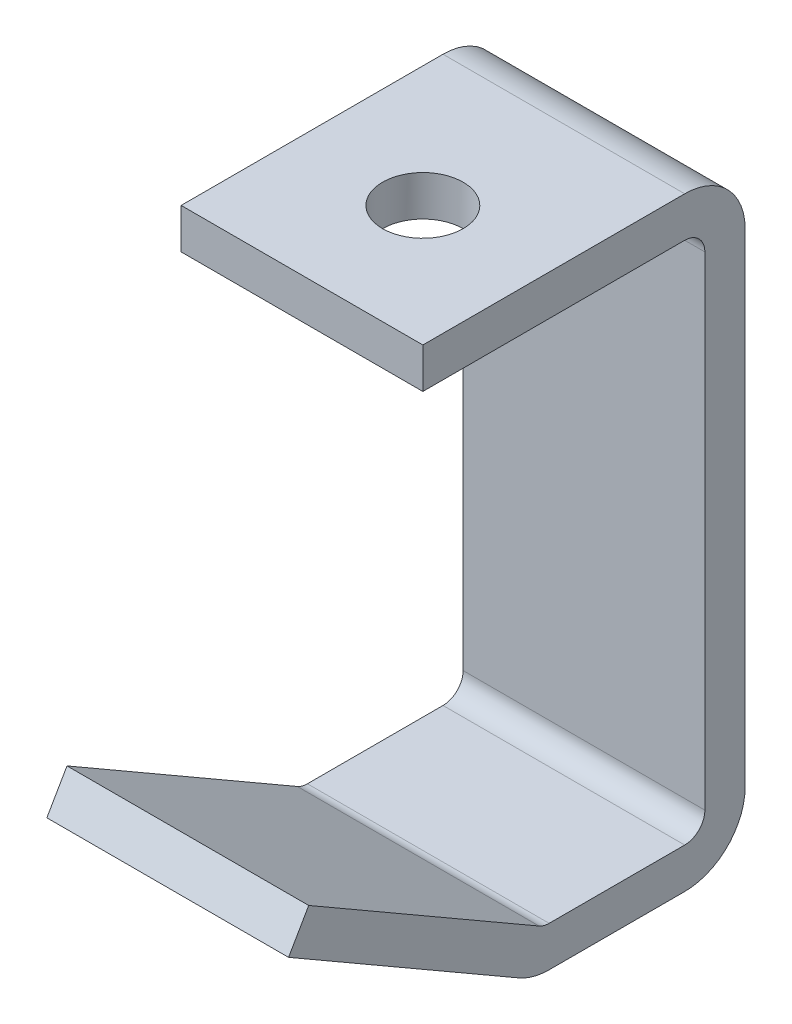
ISO-10303-21;
HEADER;
FILE_DESCRIPTION(('STEP AP214'),'2;1');
FILE_NAME('part.step','',(''),(''),'','','');
FILE_SCHEMA(('AUTOMOTIVE_DESIGN { 1 0 10303 214 1 1 1 1 }'));
ENDSEC;
DATA;
#1=APPLICATION_CONTEXT('core data for automotive mechanical design processes');
#2=APPLICATION_PROTOCOL_DEFINITION('international standard','automotive_design',2000,#1);
#3=PRODUCT_CONTEXT('',#1,'mechanical');
#4=PRODUCT('Part','Part','',(#3));
#5=PRODUCT_RELATED_PRODUCT_CATEGORY('part','',(#4));
#6=PRODUCT_DEFINITION_FORMATION('','',#4);
#7=PRODUCT_DEFINITION_CONTEXT('part definition',#1,'design');
#8=PRODUCT_DEFINITION('design','',#6,#7);
#9=PRODUCT_DEFINITION_SHAPE('','',#8);
#10=(LENGTH_UNIT() NAMED_UNIT(*) SI_UNIT(.MILLI.,.METRE.));
#11=(NAMED_UNIT(*) PLANE_ANGLE_UNIT() SI_UNIT($,.RADIAN.));
#12=(NAMED_UNIT(*) SI_UNIT($,.STERADIAN.) SOLID_ANGLE_UNIT());
#13=UNCERTAINTY_MEASURE_WITH_UNIT(LENGTH_MEASURE(1.E-05),#10,'distance_accuracy_value','');
#14=(GEOMETRIC_REPRESENTATION_CONTEXT(3) GLOBAL_UNCERTAINTY_ASSIGNED_CONTEXT((#13)) GLOBAL_UNIT_ASSIGNED_CONTEXT((#10,
#11,#12)) REPRESENTATION_CONTEXT('',''));
#15=CARTESIAN_POINT('',(0.,0.,0.));
#16=DIRECTION('',(0.,0.,1.));
#17=DIRECTION('',(1.,0.,0.));
#18=AXIS2_PLACEMENT_3D('',#15,#16,#17);
#19=CARTESIAN_POINT('',(19.05,88.9,3.175));
#20=DIRECTION('',(0.,-1.,0.));
#21=DIRECTION('',(0.,0.,-1.));
#22=AXIS2_PLACEMENT_3D('',#19,#20,#21);
#23=PLANE('',#22);
#24=CARTESIAN_POINT('',(0.,88.9,25.4));
#25=DIRECTION('',(0.,1.,0.));
#26=DIRECTION('',(0.,0.,1.));
#27=AXIS2_PLACEMENT_3D('',#24,#25,#26);
#28=CIRCLE('',#27,6.35);
#29=CARTESIAN_POINT('',(0.,88.9,31.75));
#30=VERTEX_POINT('',#29);
#31=EDGE_CURVE('E179',#30,#30,#28,.T.);
#32=ORIENTED_EDGE('',*,*,#31,.F.);
#33=EDGE_LOOP('',(#32));
#34=FACE_BOUND('',#33,.T.);
#35=DIRECTION('',(0.,0.,-1.));
#36=VECTOR('',#35,1.);
#37=CARTESIAN_POINT('',(-19.05,88.9,3.175));
#38=LINE('',#37,#36);
#39=CARTESIAN_POINT('',(-19.05,88.9,3.175));
#40=VERTEX_POINT('',#39);
#41=CARTESIAN_POINT('',(-19.05,88.9,44.45));
#42=VERTEX_POINT('',#41);
#43=EDGE_CURVE('E175',#40,#42,#38,.F.);
#44=ORIENTED_EDGE('',*,*,#43,.T.);
#45=DIRECTION('',(-1.,0.,0.));
#46=VECTOR('',#45,1.);
#47=CARTESIAN_POINT('',(19.05,88.9,44.45));
#48=LINE('',#47,#46);
#49=CARTESIAN_POINT('',(19.05,88.9,44.45));
#50=VERTEX_POINT('',#49);
#51=EDGE_CURVE('E11',#50,#42,#48,.T.);
#52=ORIENTED_EDGE('',*,*,#51,.F.);
#53=DIRECTION('',(0.,0.,-1.));
#54=VECTOR('',#53,1.);
#55=CARTESIAN_POINT('',(19.05,88.9,3.175));
#56=LINE('',#55,#54);
#57=CARTESIAN_POINT('',(19.05,88.9,3.175));
#58=VERTEX_POINT('',#57);
#59=EDGE_CURVE('E112',#58,#50,#56,.F.);
#60=ORIENTED_EDGE('',*,*,#59,.F.);
#61=DIRECTION('',(-1.,0.,0.));
#62=VECTOR('',#61,1.);
#63=CARTESIAN_POINT('',(19.05,88.9,3.175));
#64=LINE('',#63,#62);
#65=EDGE_CURVE('E171',#58,#40,#64,.T.);
#66=ORIENTED_EDGE('',*,*,#65,.T.);
#67=EDGE_LOOP('',(#44,#52,#60,#66));
#68=FACE_BOUND('',#67,.T.);
#69=ADVANCED_FACE('F32',(#34,#68),#23,.F.);
#70=CARTESIAN_POINT('',(19.05,82.55,44.45));
#71=DIRECTION('',(0.,0.,1.));
#72=DIRECTION('',(1.,0.,0.));
#73=AXIS2_PLACEMENT_3D('',#70,#71,#72);
#74=PLANE('',#73);
#75=DIRECTION('',(0.,1.,0.));
#76=VECTOR('',#75,1.);
#77=CARTESIAN_POINT('',(-19.05,82.55,44.45));
#78=LINE('',#77,#76);
#79=CARTESIAN_POINT('',(-19.05,82.55,44.45));
#80=VERTEX_POINT('',#79);
#81=EDGE_CURVE('E178',#80,#42,#78,.T.);
#82=ORIENTED_EDGE('',*,*,#81,.F.);
#83=DIRECTION('',(-1.,0.,0.));
#84=VECTOR('',#83,1.);
#85=CARTESIAN_POINT('',(19.05,82.55,44.45));
#86=LINE('',#85,#84);
#87=CARTESIAN_POINT('',(19.05,82.55,44.45));
#88=VERTEX_POINT('',#87);
#89=EDGE_CURVE('E40',#88,#80,#86,.T.);
#90=ORIENTED_EDGE('',*,*,#89,.F.);
#91=DIRECTION('',(0.,1.,0.));
#92=VECTOR('',#91,1.);
#93=CARTESIAN_POINT('',(19.05,82.55,44.45));
#94=LINE('',#93,#92);
#95=EDGE_CURVE('E261',#88,#50,#94,.T.);
#96=ORIENTED_EDGE('',*,*,#95,.T.);
#97=ORIENTED_EDGE('',*,*,#51,.T.);
#98=EDGE_LOOP('',(#82,#90,#96,#97));
#99=FACE_BOUND('',#98,.T.);
#100=ADVANCED_FACE('F248',(#99),#74,.T.);
#101=CARTESIAN_POINT('',(19.05,82.55,3.175));
#102=DIRECTION('',(0.,-1.,0.));
#103=DIRECTION('',(0.,0.,-1.));
#104=AXIS2_PLACEMENT_3D('',#101,#102,#103);
#105=PLANE('',#104);
#106=CARTESIAN_POINT('',(0.,82.55,25.4));
#107=DIRECTION('',(0.,-1.,0.));
#108=DIRECTION('',(0.,0.,-1.));
#109=AXIS2_PLACEMENT_3D('',#106,#107,#108);
#110=CIRCLE('',#109,6.35);
#111=CARTESIAN_POINT('',(0.,82.55,19.05));
#112=VERTEX_POINT('',#111);
#113=EDGE_CURVE('E317',#112,#112,#110,.F.);
#114=ORIENTED_EDGE('',*,*,#113,.T.);
#115=EDGE_LOOP('',(#114));
#116=FACE_BOUND('',#115,.T.);
#117=DIRECTION('',(0.,0.,1.));
#118=VECTOR('',#117,1.);
#119=CARTESIAN_POINT('',(-19.05,82.55,3.175));
#120=LINE('',#119,#118);
#121=CARTESIAN_POINT('',(-19.05,82.55,3.175));
#122=VERTEX_POINT('',#121);
#123=EDGE_CURVE('E182',#122,#80,#120,.T.);
#124=ORIENTED_EDGE('',*,*,#123,.F.);
#125=DIRECTION('',(-1.,0.,0.));
#126=VECTOR('',#125,1.);
#127=CARTESIAN_POINT('',(19.05,82.55,3.175));
#128=LINE('',#127,#126);
#129=CARTESIAN_POINT('',(19.05,82.55,3.175));
#130=VERTEX_POINT('',#129);
#131=EDGE_CURVE('E238',#130,#122,#128,.T.);
#132=ORIENTED_EDGE('',*,*,#131,.F.);
#133=DIRECTION('',(0.,0.,1.));
#134=VECTOR('',#133,1.);
#135=CARTESIAN_POINT('',(19.05,82.55,3.175));
#136=LINE('',#135,#134);
#137=EDGE_CURVE('E245',#130,#88,#136,.T.);
#138=ORIENTED_EDGE('',*,*,#137,.T.);
#139=ORIENTED_EDGE('',*,*,#89,.T.);
#140=EDGE_LOOP('',(#124,#132,#138,#139));
#141=FACE_BOUND('',#140,.T.);
#142=ADVANCED_FACE('F243',(#116,#141),#105,.T.);
#143=CARTESIAN_POINT('',(19.05,79.375,3.175));
#144=DIRECTION('',(-1.,0.,0.));
#145=DIRECTION('',(0.,0.,1.));
#146=AXIS2_PLACEMENT_3D('',#143,#144,#145);
#147=CYLINDRICAL_SURFACE('',#146,3.175);
#148=CARTESIAN_POINT('',(-19.05,79.375,3.175));
#149=DIRECTION('',(1.,0.,0.));
#150=DIRECTION('',(0.,0.,-1.));
#151=AXIS2_PLACEMENT_3D('',#148,#149,#150);
#152=CIRCLE('',#151,3.175);
#153=CARTESIAN_POINT('',(-19.05,79.375,0.));
#154=VERTEX_POINT('',#153);
#155=EDGE_CURVE('E185',#154,#122,#152,.T.);
#156=ORIENTED_EDGE('',*,*,#155,.F.);
#157=DIRECTION('',(-1.,0.,0.));
#158=VECTOR('',#157,1.);
#159=CARTESIAN_POINT('',(19.05,79.375,0.));
#160=LINE('',#159,#158);
#161=CARTESIAN_POINT('',(19.05,79.375,0.));
#162=VERTEX_POINT('',#161);
#163=EDGE_CURVE('E236',#162,#154,#160,.T.);
#164=ORIENTED_EDGE('',*,*,#163,.F.);
#165=CARTESIAN_POINT('',(19.05,79.375,3.175));
#166=DIRECTION('',(1.,0.,0.));
#167=DIRECTION('',(0.,0.,-1.));
#168=AXIS2_PLACEMENT_3D('',#165,#166,#167);
#169=CIRCLE('',#168,3.175);
#170=EDGE_CURVE('E258',#162,#130,#169,.T.);
#171=ORIENTED_EDGE('',*,*,#170,.T.);
#172=ORIENTED_EDGE('',*,*,#131,.T.);
#173=EDGE_LOOP('',(#156,#164,#171,#172));
#174=FACE_BOUND('',#173,.T.);
#175=ADVANCED_FACE('F255',(#174),#147,.F.);
#176=CARTESIAN_POINT('',(19.05,3.175,0.));
#177=DIRECTION('',(0.,0.,1.));
#178=DIRECTION('',(1.,0.,0.));
#179=AXIS2_PLACEMENT_3D('',#176,#177,#178);
#180=PLANE('',#179);
#181=DIRECTION('',(0.,1.,0.));
#182=VECTOR('',#181,1.);
#183=CARTESIAN_POINT('',(-19.05,3.175,0.));
#184=LINE('',#183,#182);
#185=CARTESIAN_POINT('',(-19.05,3.175,0.));
#186=VERTEX_POINT('',#185);
#187=EDGE_CURVE('E188',#186,#154,#184,.T.);
#188=ORIENTED_EDGE('',*,*,#187,.F.);
#189=DIRECTION('',(-1.,0.,0.));
#190=VECTOR('',#189,1.);
#191=CARTESIAN_POINT('',(19.05,3.175,0.));
#192=LINE('',#191,#190);
#193=CARTESIAN_POINT('',(19.05,3.175,0.));
#194=VERTEX_POINT('',#193);
#195=EDGE_CURVE('E234',#194,#186,#192,.T.);
#196=ORIENTED_EDGE('',*,*,#195,.F.);
#197=DIRECTION('',(0.,1.,0.));
#198=VECTOR('',#197,1.);
#199=CARTESIAN_POINT('',(19.05,3.175,0.));
#200=LINE('',#199,#198);
#201=EDGE_CURVE('E263',#194,#162,#200,.T.);
#202=ORIENTED_EDGE('',*,*,#201,.T.);
#203=ORIENTED_EDGE('',*,*,#163,.T.);
#204=EDGE_LOOP('',(#188,#196,#202,#203));
#205=FACE_BOUND('',#204,.T.);
#206=ADVANCED_FACE('F430',(#205),#180,.T.);
#207=CARTESIAN_POINT('',(19.05,3.175,3.175));
#208=DIRECTION('',(-1.,0.,0.));
#209=DIRECTION('',(0.,0.,1.));
#210=AXIS2_PLACEMENT_3D('',#207,#208,#209);
#211=CYLINDRICAL_SURFACE('',#210,3.175);
#212=CARTESIAN_POINT('',(-19.05,3.175,3.175));
#213=DIRECTION('',(1.,0.,0.));
#214=DIRECTION('',(0.,0.,1.));
#215=AXIS2_PLACEMENT_3D('',#212,#213,#214);
#216=CIRCLE('',#215,3.175);
#217=CARTESIAN_POINT('',(-19.05,0.,3.175));
#218=VERTEX_POINT('',#217);
#219=EDGE_CURVE('E191',#218,#186,#216,.T.);
#220=ORIENTED_EDGE('',*,*,#219,.F.);
#221=DIRECTION('',(-1.,0.,0.));
#222=VECTOR('',#221,1.);
#223=CARTESIAN_POINT('',(19.05,0.,3.175));
#224=LINE('',#223,#222);
#225=CARTESIAN_POINT('',(19.05,0.,3.175));
#226=VERTEX_POINT('',#225);
#227=EDGE_CURVE('E232',#226,#218,#224,.T.);
#228=ORIENTED_EDGE('',*,*,#227,.F.);
#229=CARTESIAN_POINT('',(19.05,3.175,3.175));
#230=DIRECTION('',(1.,0.,0.));
#231=DIRECTION('',(0.,0.,1.));
#232=AXIS2_PLACEMENT_3D('',#229,#230,#231);
#233=CIRCLE('',#232,3.175);
#234=EDGE_CURVE('E269',#226,#194,#233,.T.);
#235=ORIENTED_EDGE('',*,*,#234,.T.);
#236=ORIENTED_EDGE('',*,*,#195,.T.);
#237=EDGE_LOOP('',(#220,#228,#235,#236));
#238=FACE_BOUND('',#237,.T.);
#239=ADVANCED_FACE('F420',(#238),#211,.F.);
#240=CARTESIAN_POINT('',(19.05,0.,24.5492613140311));
#241=DIRECTION('',(0.,1.,0.));
#242=DIRECTION('',(0.,0.,1.));
#243=AXIS2_PLACEMENT_3D('',#240,#241,#242);
#244=PLANE('',#243);
#245=DIRECTION('',(0.,0.,-1.));
#246=VECTOR('',#245,1.);
#247=CARTESIAN_POINT('',(-19.05,0.,24.5492613140311));
#248=LINE('',#247,#246);
#249=CARTESIAN_POINT('',(-19.05,0.,24.5492613140311));
#250=VERTEX_POINT('',#249);
#251=EDGE_CURVE('E194',#250,#218,#248,.T.);
#252=ORIENTED_EDGE('',*,*,#251,.F.);
#253=DIRECTION('',(-1.,0.,0.));
#254=VECTOR('',#253,1.);
#255=CARTESIAN_POINT('',(19.05,0.,24.5492613140311));
#256=LINE('',#255,#254);
#257=CARTESIAN_POINT('',(19.05,0.,24.5492613140311));
#258=VERTEX_POINT('',#257);
#259=EDGE_CURVE('E230',#258,#250,#256,.T.);
#260=ORIENTED_EDGE('',*,*,#259,.F.);
#261=DIRECTION('',(0.,0.,-1.));
#262=VECTOR('',#261,1.);
#263=CARTESIAN_POINT('',(19.05,0.,24.5492613140311));
#264=LINE('',#263,#262);
#265=EDGE_CURVE('E272',#258,#226,#264,.T.);
#266=ORIENTED_EDGE('',*,*,#265,.T.);
#267=ORIENTED_EDGE('',*,*,#227,.T.);
#268=EDGE_LOOP('',(#252,#260,#266,#267));
#269=FACE_BOUND('',#268,.T.);
#270=ADVANCED_FACE('F410',(#269),#244,.T.);
#271=CARTESIAN_POINT('',(19.05,3.175,24.5492613140312));
#272=DIRECTION('',(-1.,0.,0.));
#273=DIRECTION('',(0.,0.,1.));
#274=AXIS2_PLACEMENT_3D('',#271,#272,#273);
#275=CYLINDRICAL_SURFACE('',#274,3.17499999999997);
#276=CARTESIAN_POINT('',(-19.05,3.175,24.5492613140312));
#277=DIRECTION('',(1.,0.,0.));
#278=DIRECTION('',(0.,0.,-1.));
#279=AXIS2_PLACEMENT_3D('',#276,#277,#278);
#280=CIRCLE('',#279,3.17499999999997);
#281=CARTESIAN_POINT('',(-19.05,0.425369342984386,26.1367613140311));
#282=VERTEX_POINT('',#281);
#283=EDGE_CURVE('E197',#282,#250,#280,.T.);
#284=ORIENTED_EDGE('',*,*,#283,.F.);
#285=DIRECTION('',(-1.,0.,0.));
#286=VECTOR('',#285,1.);
#287=CARTESIAN_POINT('',(19.05,0.425369342984386,26.1367613140311));
#288=LINE('',#287,#286);
#289=CARTESIAN_POINT('',(19.05,0.425369342984386,26.1367613140311));
#290=VERTEX_POINT('',#289);
#291=EDGE_CURVE('E228',#290,#282,#288,.T.);
#292=ORIENTED_EDGE('',*,*,#291,.F.);
#293=CARTESIAN_POINT('',(19.05,3.175,24.5492613140312));
#294=DIRECTION('',(1.,0.,0.));
#295=DIRECTION('',(0.,0.,-1.));
#296=AXIS2_PLACEMENT_3D('',#293,#294,#295);
#297=CIRCLE('',#296,3.17499999999997);
#298=EDGE_CURVE('E275',#290,#258,#297,.T.);
#299=ORIENTED_EDGE('',*,*,#298,.T.);
#300=ORIENTED_EDGE('',*,*,#259,.T.);
#301=EDGE_LOOP('',(#284,#292,#299,#300));
#302=FACE_BOUND('',#301,.T.);
#303=ADVANCED_FACE('F400',(#302),#275,.F.);
#304=CARTESIAN_POINT('',(19.05,21.3868,62.443024211314));
#305=DIRECTION('',(0.,0.866025403784439,-0.5));
#306=DIRECTION('',(0.,0.5,0.866025403784439));
#307=AXIS2_PLACEMENT_3D('',#304,#305,#306);
#308=PLANE('',#307);
#309=DIRECTION('',(0.,-0.5,-0.866025403784439));
#310=VECTOR('',#309,1.);
#311=CARTESIAN_POINT('',(-19.05,21.3868,62.443024211314));
#312=LINE('',#311,#310);
#313=CARTESIAN_POINT('',(-19.05,21.3868,62.443024211314));
#314=VERTEX_POINT('',#313);
#315=EDGE_CURVE('E200',#314,#282,#312,.T.);
#316=ORIENTED_EDGE('',*,*,#315,.F.);
#317=DIRECTION('',(-1.,0.,0.));
#318=VECTOR('',#317,1.);
#319=CARTESIAN_POINT('',(19.05,21.3868,62.443024211314));
#320=LINE('',#319,#318);
#321=CARTESIAN_POINT('',(19.05,21.3868,62.443024211314));
#322=VERTEX_POINT('',#321);
#323=EDGE_CURVE('E226',#322,#314,#320,.T.);
#324=ORIENTED_EDGE('',*,*,#323,.F.);
#325=DIRECTION('',(0.,-0.5,-0.866025403784439));
#326=VECTOR('',#325,1.);
#327=CARTESIAN_POINT('',(19.05,21.3868,62.443024211314));
#328=LINE('',#327,#326);
#329=EDGE_CURVE('E278',#322,#290,#328,.T.);
#330=ORIENTED_EDGE('',*,*,#329,.T.);
#331=ORIENTED_EDGE('',*,*,#291,.T.);
#332=EDGE_LOOP('',(#316,#324,#330,#331));
#333=FACE_BOUND('',#332,.T.);
#334=ADVANCED_FACE('F390',(#333),#308,.T.);
#335=CARTESIAN_POINT('',(19.05,15.8875386859689,65.618024211314));
#336=DIRECTION('',(0.,0.5,0.866025403784439));
#337=DIRECTION('',(0.,-0.866025403784439,0.5));
#338=AXIS2_PLACEMENT_3D('',#335,#336,#337);
#339=PLANE('',#338);
#340=DIRECTION('',(0.,0.866025403784439,-0.5));
#341=VECTOR('',#340,1.);
#342=CARTESIAN_POINT('',(-19.05,15.8875386859689,65.618024211314));
#343=LINE('',#342,#341);
#344=CARTESIAN_POINT('',(-19.05,15.8875386859689,65.618024211314));
#345=VERTEX_POINT('',#344);
#346=EDGE_CURVE('E203',#345,#314,#343,.T.);
#347=ORIENTED_EDGE('',*,*,#346,.F.);
#348=DIRECTION('',(-1.,0.,0.));
#349=VECTOR('',#348,1.);
#350=CARTESIAN_POINT('',(19.05,15.8875386859689,65.618024211314));
#351=LINE('',#350,#349);
#352=CARTESIAN_POINT('',(19.05,15.8875386859689,65.618024211314));
#353=VERTEX_POINT('',#352);
#354=EDGE_CURVE('E224',#353,#345,#351,.T.);
#355=ORIENTED_EDGE('',*,*,#354,.F.);
#356=DIRECTION('',(0.,0.866025403784439,-0.5));
#357=VECTOR('',#356,1.);
#358=CARTESIAN_POINT('',(19.05,15.8875386859689,65.618024211314));
#359=LINE('',#358,#357);
#360=EDGE_CURVE('E281',#353,#322,#359,.T.);
#361=ORIENTED_EDGE('',*,*,#360,.T.);
#362=ORIENTED_EDGE('',*,*,#323,.T.);
#363=EDGE_LOOP('',(#347,#355,#361,#362));
#364=FACE_BOUND('',#363,.T.);
#365=ADVANCED_FACE('F380',(#364),#339,.T.);
#366=CARTESIAN_POINT('',(19.05,15.8875386859689,65.618024211314));
#367=DIRECTION('',(0.,0.866025403784439,-0.5));
#368=DIRECTION('',(0.,0.5,0.866025403784439));
#369=AXIS2_PLACEMENT_3D('',#366,#367,#368);
#370=PLANE('',#369);
#371=DIRECTION('',(0.,-0.5,-0.866025403784439));
#372=VECTOR('',#371,1.);
#373=CARTESIAN_POINT('',(-19.05,15.8875386859689,65.618024211314));
#374=LINE('',#373,#372);
#375=CARTESIAN_POINT('',(-19.05,-5.0738919710469,29.3117613140309));
#376=VERTEX_POINT('',#375);
#377=EDGE_CURVE('E206',#345,#376,#374,.T.);
#378=ORIENTED_EDGE('',*,*,#377,.T.);
#379=DIRECTION('',(-1.,0.,0.));
#380=VECTOR('',#379,1.);
#381=CARTESIAN_POINT('',(19.05,-5.0738919710469,29.3117613140309));
#382=LINE('',#381,#380);
#383=CARTESIAN_POINT('',(19.05,-5.0738919710469,29.3117613140309));
#384=VERTEX_POINT('',#383);
#385=EDGE_CURVE('E221',#384,#376,#382,.T.);
#386=ORIENTED_EDGE('',*,*,#385,.F.);
#387=DIRECTION('',(0.,-0.5,-0.866025403784439));
#388=VECTOR('',#387,1.);
#389=CARTESIAN_POINT('',(19.05,15.8875386859689,65.618024211314));
#390=LINE('',#389,#388);
#391=EDGE_CURVE('E284',#353,#384,#390,.T.);
#392=ORIENTED_EDGE('',*,*,#391,.F.);
#393=ORIENTED_EDGE('',*,*,#354,.T.);
#394=EDGE_LOOP('',(#378,#386,#392,#393));
#395=FACE_BOUND('',#394,.T.);
#396=ADVANCED_FACE('F371',(#395),#370,.F.);
#397=CARTESIAN_POINT('',(19.05,3.175,24.5492613140312));
#398=DIRECTION('',(-1.,0.,0.));
#399=DIRECTION('',(0.,0.,1.));
#400=AXIS2_PLACEMENT_3D('',#397,#398,#399);
#401=CYLINDRICAL_SURFACE('',#400,9.52499999999997);
#402=CARTESIAN_POINT('',(-19.05,3.175,24.5492613140312));
#403=DIRECTION('',(1.,0.,0.));
#404=DIRECTION('',(0.,0.,-1.));
#405=AXIS2_PLACEMENT_3D('',#402,#403,#404);
#406=CIRCLE('',#405,9.52499999999997);
#407=CARTESIAN_POINT('',(-19.05,-6.35,24.5492613140311));
#408=VERTEX_POINT('',#407);
#409=EDGE_CURVE('E208',#376,#408,#406,.T.);
#410=ORIENTED_EDGE('',*,*,#409,.T.);
#411=DIRECTION('',(-1.,0.,0.));
#412=VECTOR('',#411,1.);
#413=CARTESIAN_POINT('',(19.05,-6.35,24.5492613140311));
#414=LINE('',#413,#412);
#415=CARTESIAN_POINT('',(19.05,-6.35,24.5492613140311));
#416=VERTEX_POINT('',#415);
#417=EDGE_CURVE('E218',#416,#408,#414,.T.);
#418=ORIENTED_EDGE('',*,*,#417,.F.);
#419=CARTESIAN_POINT('',(19.05,3.175,24.5492613140312));
#420=DIRECTION('',(1.,0.,0.));
#421=DIRECTION('',(0.,0.,-1.));
#422=AXIS2_PLACEMENT_3D('',#419,#420,#421);
#423=CIRCLE('',#422,9.52499999999997);
#424=EDGE_CURVE('E286',#384,#416,#423,.T.);
#425=ORIENTED_EDGE('',*,*,#424,.F.);
#426=ORIENTED_EDGE('',*,*,#385,.T.);
#427=EDGE_LOOP('',(#410,#418,#425,#426));
#428=FACE_BOUND('',#427,.T.);
#429=ADVANCED_FACE('F293',(#428),#401,.T.);
#430=CARTESIAN_POINT('',(19.05,-6.35,24.5492613140311));
#431=DIRECTION('',(0.,1.,0.));
#432=DIRECTION('',(0.,0.,1.));
#433=AXIS2_PLACEMENT_3D('',#430,#431,#432);
#434=PLANE('',#433);
#435=DIRECTION('',(0.,0.,-1.));
#436=VECTOR('',#435,1.);
#437=CARTESIAN_POINT('',(-19.05,-6.35,24.5492613140311));
#438=LINE('',#437,#436);
#439=CARTESIAN_POINT('',(-19.05,-6.35,3.175));
#440=VERTEX_POINT('',#439);
#441=EDGE_CURVE('E210',#408,#440,#438,.T.);
#442=ORIENTED_EDGE('',*,*,#441,.T.);
#443=DIRECTION('',(-1.,0.,0.));
#444=VECTOR('',#443,1.);
#445=CARTESIAN_POINT('',(19.05,-6.35,3.175));
#446=LINE('',#445,#444);
#447=CARTESIAN_POINT('',(19.05,-6.35,3.175));
#448=VERTEX_POINT('',#447);
#449=EDGE_CURVE('E166',#448,#440,#446,.T.);
#450=ORIENTED_EDGE('',*,*,#449,.F.);
#451=DIRECTION('',(0.,0.,-1.));
#452=VECTOR('',#451,1.);
#453=CARTESIAN_POINT('',(19.05,-6.35,24.5492613140311));
#454=LINE('',#453,#452);
#455=EDGE_CURVE('E157',#416,#448,#454,.T.);
#456=ORIENTED_EDGE('',*,*,#455,.F.);
#457=ORIENTED_EDGE('',*,*,#417,.T.);
#458=EDGE_LOOP('',(#442,#450,#456,#457));
#459=FACE_BOUND('',#458,.T.);
#460=ADVANCED_FACE('F297',(#459),#434,.F.);
#461=CARTESIAN_POINT('',(19.05,3.175,3.175));
#462=DIRECTION('',(-1.,0.,0.));
#463=DIRECTION('',(0.,0.,1.));
#464=AXIS2_PLACEMENT_3D('',#461,#462,#463);
#465=CYLINDRICAL_SURFACE('',#464,9.525);
#466=CARTESIAN_POINT('',(-19.05,3.175,3.175));
#467=DIRECTION('',(1.,0.,0.));
#468=DIRECTION('',(0.,0.,-1.));
#469=AXIS2_PLACEMENT_3D('',#466,#467,#468);
#470=CIRCLE('',#469,9.525);
#471=CARTESIAN_POINT('',(-19.05,3.175,-6.35));
#472=VERTEX_POINT('',#471);
#473=EDGE_CURVE('E165',#440,#472,#470,.T.);
#474=ORIENTED_EDGE('',*,*,#473,.T.);
#475=DIRECTION('',(-1.,0.,0.));
#476=VECTOR('',#475,1.);
#477=CARTESIAN_POINT('',(19.05,3.175,-6.35));
#478=LINE('',#477,#476);
#479=CARTESIAN_POINT('',(19.05,3.175,-6.35));
#480=VERTEX_POINT('',#479);
#481=EDGE_CURVE('E162',#480,#472,#478,.T.);
#482=ORIENTED_EDGE('',*,*,#481,.F.);
#483=CARTESIAN_POINT('',(19.05,3.175,3.175));
#484=DIRECTION('',(1.,0.,0.));
#485=DIRECTION('',(0.,0.,-1.));
#486=AXIS2_PLACEMENT_3D('',#483,#484,#485);
#487=CIRCLE('',#486,9.525);
#488=EDGE_CURVE('E151',#448,#480,#487,.T.);
#489=ORIENTED_EDGE('',*,*,#488,.F.);
#490=ORIENTED_EDGE('',*,*,#449,.T.);
#491=EDGE_LOOP('',(#474,#482,#489,#490));
#492=FACE_BOUND('',#491,.T.);
#493=ADVANCED_FACE('F163',(#492),#465,.T.);
#494=CARTESIAN_POINT('',(19.05,3.175,-6.35));
#495=DIRECTION('',(0.,0.,1.));
#496=DIRECTION('',(1.,0.,0.));
#497=AXIS2_PLACEMENT_3D('',#494,#495,#496);
#498=PLANE('',#497);
#499=DIRECTION('',(0.,1.,0.));
#500=VECTOR('',#499,1.);
#501=CARTESIAN_POINT('',(-19.05,3.175,-6.35));
#502=LINE('',#501,#500);
#503=CARTESIAN_POINT('',(-19.05,79.375,-6.35));
#504=VERTEX_POINT('',#503);
#505=EDGE_CURVE('E100',#472,#504,#502,.T.);
#506=ORIENTED_EDGE('',*,*,#505,.T.);
#507=DIRECTION('',(-1.,0.,0.));
#508=VECTOR('',#507,1.);
#509=CARTESIAN_POINT('',(19.05,79.375,-6.35));
#510=LINE('',#509,#508);
#511=CARTESIAN_POINT('',(19.05,79.375,-6.35));
#512=VERTEX_POINT('',#511);
#513=EDGE_CURVE('E167',#512,#504,#510,.T.);
#514=ORIENTED_EDGE('',*,*,#513,.F.);
#515=DIRECTION('',(0.,1.,0.));
#516=VECTOR('',#515,1.);
#517=CARTESIAN_POINT('',(19.05,3.175,-6.35));
#518=LINE('',#517,#516);
#519=EDGE_CURVE('E155',#480,#512,#518,.T.);
#520=ORIENTED_EDGE('',*,*,#519,.F.);
#521=ORIENTED_EDGE('',*,*,#481,.T.);
#522=EDGE_LOOP('',(#506,#514,#520,#521));
#523=FACE_BOUND('',#522,.T.);
#524=ADVANCED_FACE('F169',(#523),#498,.F.);
#525=CARTESIAN_POINT('',(19.05,79.375,3.175));
#526=DIRECTION('',(-1.,0.,0.));
#527=DIRECTION('',(0.,0.,1.));
#528=AXIS2_PLACEMENT_3D('',#525,#526,#527);
#529=CYLINDRICAL_SURFACE('',#528,9.525);
#530=CARTESIAN_POINT('',(-19.05,79.375,3.175));
#531=DIRECTION('',(1.,0.,0.));
#532=DIRECTION('',(0.,0.,-1.));
#533=AXIS2_PLACEMENT_3D('',#530,#531,#532);
#534=CIRCLE('',#533,9.525);
#535=EDGE_CURVE('E106',#504,#40,#534,.T.);
#536=ORIENTED_EDGE('',*,*,#535,.T.);
#537=ORIENTED_EDGE('',*,*,#65,.F.);
#538=CARTESIAN_POINT('',(19.05,79.375,3.175));
#539=DIRECTION('',(1.,0.,0.));
#540=DIRECTION('',(0.,0.,-1.));
#541=AXIS2_PLACEMENT_3D('',#538,#539,#540);
#542=CIRCLE('',#541,9.525);
#543=EDGE_CURVE('E48',#512,#58,#542,.T.);
#544=ORIENTED_EDGE('',*,*,#543,.F.);
#545=ORIENTED_EDGE('',*,*,#513,.T.);
#546=EDGE_LOOP('',(#536,#537,#544,#545));
#547=FACE_BOUND('',#546,.T.);
#548=ADVANCED_FACE('F299',(#547),#529,.T.);
#549=CARTESIAN_POINT('',(19.05,79.375,3.175));
#550=DIRECTION('',(1.,0.,0.));
#551=DIRECTION('',(0.,0.,-1.));
#552=AXIS2_PLACEMENT_3D('',#549,#550,#551);
#553=PLANE('',#552);
#554=ORIENTED_EDGE('',*,*,#59,.T.);
#555=ORIENTED_EDGE('',*,*,#95,.F.);
#556=ORIENTED_EDGE('',*,*,#137,.F.);
#557=ORIENTED_EDGE('',*,*,#170,.F.);
#558=ORIENTED_EDGE('',*,*,#201,.F.);
#559=ORIENTED_EDGE('',*,*,#234,.F.);
#560=ORIENTED_EDGE('',*,*,#265,.F.);
#561=ORIENTED_EDGE('',*,*,#298,.F.);
#562=ORIENTED_EDGE('',*,*,#329,.F.);
#563=ORIENTED_EDGE('',*,*,#360,.F.);
#564=ORIENTED_EDGE('',*,*,#391,.T.);
#565=ORIENTED_EDGE('',*,*,#424,.T.);
#566=ORIENTED_EDGE('',*,*,#455,.T.);
#567=ORIENTED_EDGE('',*,*,#488,.T.);
#568=ORIENTED_EDGE('',*,*,#519,.T.);
#569=ORIENTED_EDGE('',*,*,#543,.T.);
#570=EDGE_LOOP('',(#554,#555,#556,#557,#558,#559,#560,#561,#562,#563,#564,#565,#566,#567,#568,#569));
#571=FACE_BOUND('',#570,.T.);
#572=ADVANCED_FACE('F153',(#571),#553,.T.);
#573=CARTESIAN_POINT('',(-19.05,79.375,3.175));
#574=DIRECTION('',(1.,0.,0.));
#575=DIRECTION('',(0.,0.,-1.));
#576=AXIS2_PLACEMENT_3D('',#573,#574,#575);
#577=PLANE('',#576);
#578=ORIENTED_EDGE('',*,*,#43,.F.);
#579=ORIENTED_EDGE('',*,*,#535,.F.);
#580=ORIENTED_EDGE('',*,*,#505,.F.);
#581=ORIENTED_EDGE('',*,*,#473,.F.);
#582=ORIENTED_EDGE('',*,*,#441,.F.);
#583=ORIENTED_EDGE('',*,*,#409,.F.);
#584=ORIENTED_EDGE('',*,*,#377,.F.);
#585=ORIENTED_EDGE('',*,*,#346,.T.);
#586=ORIENTED_EDGE('',*,*,#315,.T.);
#587=ORIENTED_EDGE('',*,*,#283,.T.);
#588=ORIENTED_EDGE('',*,*,#251,.T.);
#589=ORIENTED_EDGE('',*,*,#219,.T.);
#590=ORIENTED_EDGE('',*,*,#187,.T.);
#591=ORIENTED_EDGE('',*,*,#155,.T.);
#592=ORIENTED_EDGE('',*,*,#123,.T.);
#593=ORIENTED_EDGE('',*,*,#81,.T.);
#594=EDGE_LOOP('',(#578,#579,#580,#581,#582,#583,#584,#585,#586,#587,#588,#589,#590,#591,#592,#593));
#595=FACE_BOUND('',#594,.T.);
#596=ADVANCED_FACE('F251',(#595),#577,.F.);
#597=CARTESIAN_POINT('',(0.,-6.35100000000001,25.4));
#598=DIRECTION('',(0.,1.,0.));
#599=DIRECTION('',(0.,0.,1.));
#600=AXIS2_PLACEMENT_3D('',#597,#598,#599);
#601=CYLINDRICAL_SURFACE('',#600,6.35);
#602=ORIENTED_EDGE('',*,*,#113,.F.);
#603=EDGE_LOOP('',(#602));
#604=FACE_BOUND('',#603,.T.);
#605=ORIENTED_EDGE('',*,*,#31,.T.);
#606=EDGE_LOOP('',(#605));
#607=FACE_BOUND('',#606,.T.);
#608=ADVANCED_FACE('F324',(#604,#607),#601,.F.);
#609=CLOSED_SHELL('',(#69,#100,#142,#175,#206,#239,#270,#303,#334,#365,#396,#429,#460,#493,#524,
#548,#572,#596,#608));
#610=MANIFOLD_SOLID_BREP('B2',#609);
#611=ADVANCED_BREP_SHAPE_REPRESENTATION('',(#18,#610),#14);
#612=SHAPE_DEFINITION_REPRESENTATION(#9,#611);
ENDSEC;
END-ISO-10303-21;
